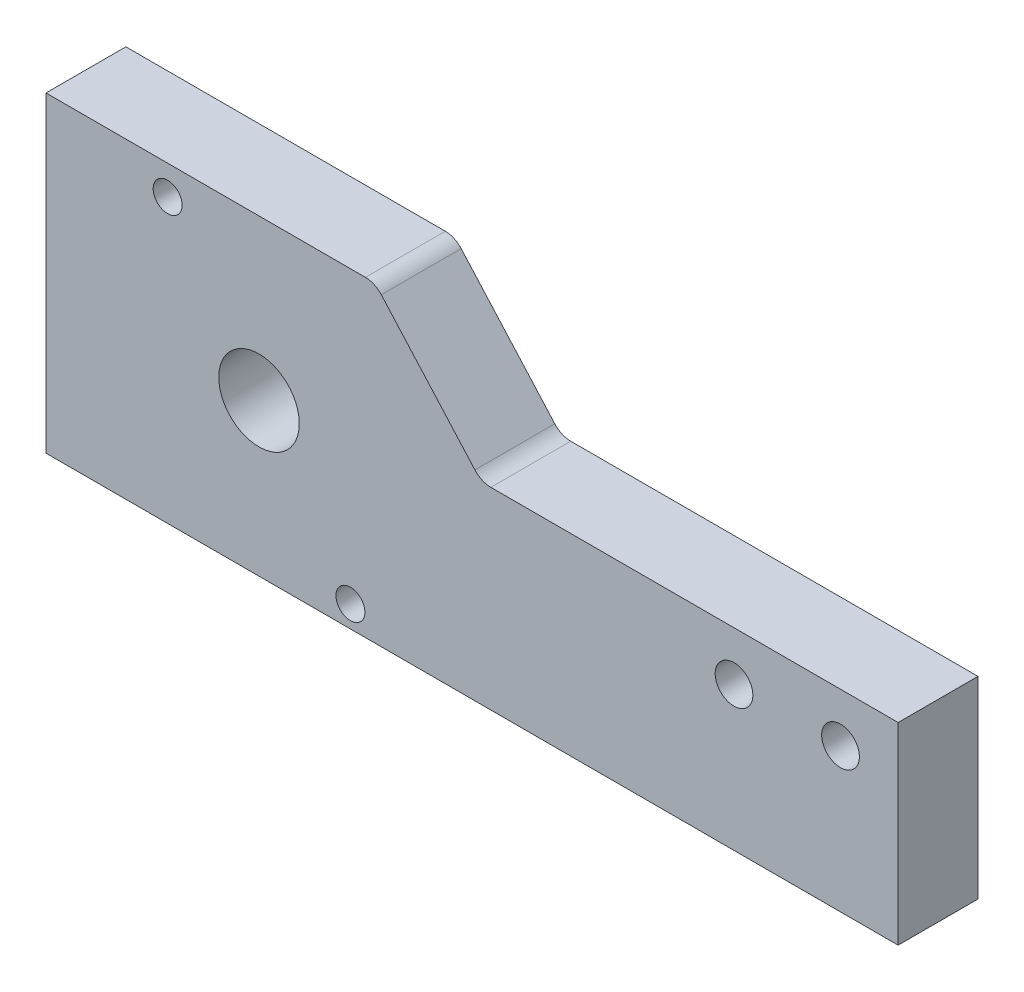
ISO-10303-21;
HEADER;
FILE_DESCRIPTION(('STEP AP214'),'2;1');
FILE_NAME('part.step','',(''),(''),'','','');
FILE_SCHEMA(('AUTOMOTIVE_DESIGN { 1 0 10303 214 1 1 1 1 }'));
ENDSEC;
DATA;
#1=APPLICATION_CONTEXT('core data for automotive mechanical design processes');
#2=APPLICATION_PROTOCOL_DEFINITION('international standard','automotive_design',2000,#1);
#3=PRODUCT_CONTEXT('',#1,'mechanical');
#4=PRODUCT('Part','Part','',(#3));
#5=PRODUCT_RELATED_PRODUCT_CATEGORY('part','',(#4));
#6=PRODUCT_DEFINITION_FORMATION('','',#4);
#7=PRODUCT_DEFINITION_CONTEXT('part definition',#1,'design');
#8=PRODUCT_DEFINITION('design','',#6,#7);
#9=PRODUCT_DEFINITION_SHAPE('','',#8);
#10=(LENGTH_UNIT() NAMED_UNIT(*) SI_UNIT(.MILLI.,.METRE.));
#11=(NAMED_UNIT(*) PLANE_ANGLE_UNIT() SI_UNIT($,.RADIAN.));
#12=(NAMED_UNIT(*) SI_UNIT($,.STERADIAN.) SOLID_ANGLE_UNIT());
#13=UNCERTAINTY_MEASURE_WITH_UNIT(LENGTH_MEASURE(1.E-05),#10,'distance_accuracy_value','');
#14=(GEOMETRIC_REPRESENTATION_CONTEXT(3) GLOBAL_UNCERTAINTY_ASSIGNED_CONTEXT((#13)) GLOBAL_UNIT_ASSIGNED_CONTEXT((#10,
#11,#12)) REPRESENTATION_CONTEXT('',''));
#15=CARTESIAN_POINT('',(0.,0.,0.));
#16=DIRECTION('',(0.,0.,1.));
#17=DIRECTION('',(1.,0.,0.));
#18=AXIS2_PLACEMENT_3D('',#15,#16,#17);
#19=CARTESIAN_POINT('',(-50.8,-25.4,9.525));
#20=DIRECTION('',(1.,0.,0.));
#21=DIRECTION('',(0.,0.,-1.));
#22=AXIS2_PLACEMENT_3D('',#19,#20,#21);
#23=PLANE('',#22);
#24=DIRECTION('',(0.,-1.,0.));
#25=VECTOR('',#24,1.);
#26=CARTESIAN_POINT('',(-50.8,-25.4,0.));
#27=LINE('',#26,#25);
#28=CARTESIAN_POINT('',(-50.8,25.4,0.));
#29=VERTEX_POINT('',#28);
#30=CARTESIAN_POINT('',(-50.8,-11.8015182196212,0.));
#31=VERTEX_POINT('',#30);
#32=EDGE_CURVE('E130',#29,#31,#27,.T.);
#33=ORIENTED_EDGE('',*,*,#32,.T.);
#34=DIRECTION('',(0.,0.,1.));
#35=VECTOR('',#34,1.);
#36=CARTESIAN_POINT('',(-50.8,-11.8015182196212,0.));
#37=LINE('',#36,#35);
#38=CARTESIAN_POINT('',(-50.8,-11.8015182196212,9.525));
#39=VERTEX_POINT('',#38);
#40=EDGE_CURVE('E301',#31,#39,#37,.T.);
#41=ORIENTED_EDGE('',*,*,#40,.T.);
#42=DIRECTION('',(0.,-1.,0.));
#43=VECTOR('',#42,1.);
#44=CARTESIAN_POINT('',(-50.8,-25.4,9.525));
#45=LINE('',#44,#43);
#46=CARTESIAN_POINT('',(-50.8,25.4,9.525));
#47=VERTEX_POINT('',#46);
#48=EDGE_CURVE('E132',#47,#39,#45,.T.);
#49=ORIENTED_EDGE('',*,*,#48,.F.);
#50=DIRECTION('',(0.,0.,-1.));
#51=VECTOR('',#50,1.);
#52=CARTESIAN_POINT('',(-50.8,25.4,9.525));
#53=LINE('',#52,#51);
#54=EDGE_CURVE('E139',#47,#29,#53,.T.);
#55=ORIENTED_EDGE('',*,*,#54,.T.);
#56=EDGE_LOOP('',(#33,#41,#49,#55));
#57=FACE_BOUND('',#56,.T.);
#58=ADVANCED_FACE('F39',(#57),#23,.F.);
#59=CARTESIAN_POINT('',(50.8,-25.4,9.525));
#60=DIRECTION('',(-1.,0.,0.));
#61=DIRECTION('',(0.,-1.,0.));
#62=AXIS2_PLACEMENT_3D('',#59,#60,#61);
#63=PLANE('',#62);
#64=DIRECTION('',(0.,1.,0.));
#65=VECTOR('',#64,1.);
#66=CARTESIAN_POINT('',(50.8,-25.4,0.));
#67=LINE('',#66,#65);
#68=CARTESIAN_POINT('',(50.8,-11.8015182196212,0.));
#69=VERTEX_POINT('',#68);
#70=CARTESIAN_POINT('',(50.8,11.1938850786653,0.));
#71=VERTEX_POINT('',#70);
#72=EDGE_CURVE('E108',#69,#71,#67,.T.);
#73=ORIENTED_EDGE('',*,*,#72,.T.);
#74=DIRECTION('',(0.,0.,1.));
#75=VECTOR('',#74,1.);
#76=CARTESIAN_POINT('',(50.8,11.1938850786653,0.));
#77=LINE('',#76,#75);
#78=CARTESIAN_POINT('',(50.8,11.1938850786653,9.525));
#79=VERTEX_POINT('',#78);
#80=EDGE_CURVE('E114',#71,#79,#77,.T.);
#81=ORIENTED_EDGE('',*,*,#80,.T.);
#82=DIRECTION('',(0.,1.,0.));
#83=VECTOR('',#82,1.);
#84=CARTESIAN_POINT('',(50.8,-25.4,9.525));
#85=LINE('',#84,#83);
#86=CARTESIAN_POINT('',(50.8,-11.8015182196212,9.525));
#87=VERTEX_POINT('',#86);
#88=EDGE_CURVE('E310',#87,#79,#85,.T.);
#89=ORIENTED_EDGE('',*,*,#88,.F.);
#90=DIRECTION('',(0.,0.,1.));
#91=VECTOR('',#90,1.);
#92=CARTESIAN_POINT('',(50.8,-11.8015182196212,0.));
#93=LINE('',#92,#91);
#94=EDGE_CURVE('E128',#69,#87,#93,.T.);
#95=ORIENTED_EDGE('',*,*,#94,.F.);
#96=EDGE_LOOP('',(#73,#81,#89,#95));
#97=FACE_BOUND('',#96,.T.);
#98=ADVANCED_FACE('F127',(#97),#63,.F.);
#99=CARTESIAN_POINT('',(50.8,25.4,9.525));
#100=DIRECTION('',(0.,-1.,0.));
#101=DIRECTION('',(1.,0.,0.));
#102=AXIS2_PLACEMENT_3D('',#99,#100,#101);
#103=PLANE('',#102);
#104=DIRECTION('',(-1.,0.,0.));
#105=VECTOR('',#104,1.);
#106=CARTESIAN_POINT('',(50.8,25.4,9.525));
#107=LINE('',#106,#105);
#108=CARTESIAN_POINT('',(-12.7145745700629,25.4,9.525));
#109=VERTEX_POINT('',#108);
#110=EDGE_CURVE('E143',#109,#47,#107,.T.);
#111=ORIENTED_EDGE('',*,*,#110,.F.);
#112=DIRECTION('',(0.,0.,1.));
#113=VECTOR('',#112,1.);
#114=CARTESIAN_POINT('',(-12.7145745700629,25.4,9.525));
#115=LINE('',#114,#113);
#116=CARTESIAN_POINT('',(-12.7145745700629,25.4,0.));
#117=VERTEX_POINT('',#116);
#118=EDGE_CURVE('E54',#109,#117,#115,.F.);
#119=ORIENTED_EDGE('',*,*,#118,.T.);
#120=DIRECTION('',(-1.,0.,0.));
#121=VECTOR('',#120,1.);
#122=CARTESIAN_POINT('',(50.8,25.4,0.));
#123=LINE('',#122,#121);
#124=EDGE_CURVE('E129',#117,#29,#123,.T.);
#125=ORIENTED_EDGE('',*,*,#124,.T.);
#126=ORIENTED_EDGE('',*,*,#54,.F.);
#127=EDGE_LOOP('',(#111,#119,#125,#126));
#128=FACE_BOUND('',#127,.T.);
#129=ADVANCED_FACE('F180',(#128),#103,.F.);
#130=CARTESIAN_POINT('',(0.,0.,9.525));
#131=DIRECTION('',(0.,0.,1.));
#132=DIRECTION('',(1.,0.,0.));
#133=AXIS2_PLACEMENT_3D('',#130,#131,#132);
#134=PLANE('',#133);
#135=DIRECTION('',(0.665685747327236,-0.746232192956977,0.));
#136=VECTOR('',#135,1.);
#137=CARTESIAN_POINT('',(1.09609525507062,11.1938850786653,9.525));
#138=LINE('',#137,#136);
#139=CARTESIAN_POINT('',(-10.8191447999521,24.5508417982112,9.525));
#140=VERTEX_POINT('',#139);
#141=CARTESIAN_POINT('',(0.338593076134966,12.0430432804541,9.525));
#142=VERTEX_POINT('',#141);
#143=EDGE_CURVE('E156',#140,#142,#138,.T.);
#144=ORIENTED_EDGE('',*,*,#143,.F.);
#145=CARTESIAN_POINT('',(-12.7145745700629,22.86,9.525));
#146=DIRECTION('',(0.,0.,1.));
#147=DIRECTION('',(1.,0.,0.));
#148=AXIS2_PLACEMENT_3D('',#145,#146,#147);
#149=CIRCLE('',#148,2.54);
#150=EDGE_CURVE('E62',#140,#109,#149,.T.);
#151=ORIENTED_EDGE('',*,*,#150,.T.);
#152=ORIENTED_EDGE('',*,*,#110,.T.);
#153=ORIENTED_EDGE('',*,*,#48,.T.);
#154=DIRECTION('',(-1.,0.,0.));
#155=VECTOR('',#154,1.);
#156=CARTESIAN_POINT('',(-50.8,-11.8015182196212,9.525));
#157=LINE('',#156,#155);
#158=EDGE_CURVE('E124',#87,#39,#157,.T.);
#159=ORIENTED_EDGE('',*,*,#158,.F.);
#160=ORIENTED_EDGE('',*,*,#88,.T.);
#161=DIRECTION('',(1.,0.,0.));
#162=VECTOR('',#161,1.);
#163=CARTESIAN_POINT('',(50.8,11.1938850786653,9.525));
#164=LINE('',#163,#162);
#165=CARTESIAN_POINT('',(2.23402284624569,11.1938850786653,9.525));
#166=VERTEX_POINT('',#165);
#167=EDGE_CURVE('E120',#166,#79,#164,.T.);
#168=ORIENTED_EDGE('',*,*,#167,.F.);
#169=CARTESIAN_POINT('',(2.23402284624569,13.7338850786653,9.525));
#170=DIRECTION('',(0.,0.,1.));
#171=DIRECTION('',(1.,0.,0.));
#172=AXIS2_PLACEMENT_3D('',#169,#170,#171);
#173=CIRCLE('',#172,2.54);
#174=EDGE_CURVE('E47',#166,#142,#173,.F.);
#175=ORIENTED_EDGE('',*,*,#174,.T.);
#176=EDGE_LOOP('',(#144,#151,#152,#153,#159,#160,#168,#175));
#177=FACE_BOUND('',#176,.T.);
#178=CARTESIAN_POINT('',(31.2318140566515,5.34348178041263,9.525));
#179=DIRECTION('',(0.,0.,1.));
#180=DIRECTION('',(1.,0.,0.));
#181=AXIS2_PLACEMENT_3D('',#178,#179,#180);
#182=CIRCLE('',#181,2.2479);
#183=CARTESIAN_POINT('',(33.4797140566515,5.34348178041263,9.525));
#184=VERTEX_POINT('',#183);
#185=EDGE_CURVE('E307',#184,#184,#182,.T.);
#186=ORIENTED_EDGE('',*,*,#185,.F.);
#187=EDGE_LOOP('',(#186));
#188=FACE_BOUND('',#187,.T.);
#189=CARTESIAN_POINT('',(43.9318140566515,5.34348178041787,9.525));
#190=DIRECTION('',(0.,0.,1.));
#191=DIRECTION('',(1.,0.,0.));
#192=AXIS2_PLACEMENT_3D('',#189,#190,#191);
#193=CIRCLE('',#192,2.2479);
#194=CARTESIAN_POINT('',(46.1797140566515,5.34348178041787,9.525));
#195=VERTEX_POINT('',#194);
#196=EDGE_CURVE('E334',#195,#195,#193,.T.);
#197=ORIENTED_EDGE('',*,*,#196,.F.);
#198=EDGE_LOOP('',(#197));
#199=FACE_BOUND('',#198,.T.);
#200=CARTESIAN_POINT('',(-36.29795229067,21.9138888414908,9.525));
#201=DIRECTION('',(0.,0.,1.));
#202=DIRECTION('',(1.,0.,0.));
#203=AXIS2_PLACEMENT_3D('',#200,#201,#202);
#204=CIRCLE('',#203,1.72719999999998);
#205=CARTESIAN_POINT('',(-34.57075229067,21.9138888414908,9.525));
#206=VERTEX_POINT('',#205);
#207=EDGE_CURVE('E328',#206,#206,#204,.T.);
#208=ORIENTED_EDGE('',*,*,#207,.F.);
#209=EDGE_LOOP('',(#208));
#210=FACE_BOUND('',#209,.T.);
#211=CARTESIAN_POINT('',(-14.50204770933,-9.21388884149079,9.525));
#212=DIRECTION('',(0.,0.,1.));
#213=DIRECTION('',(1.,0.,0.));
#214=AXIS2_PLACEMENT_3D('',#211,#212,#213);
#215=CIRCLE('',#214,1.72719999999999);
#216=CARTESIAN_POINT('',(-12.7748477093301,-9.21388884149079,9.525));
#217=VERTEX_POINT('',#216);
#218=EDGE_CURVE('E322',#217,#217,#215,.T.);
#219=ORIENTED_EDGE('',*,*,#218,.F.);
#220=EDGE_LOOP('',(#219));
#221=FACE_BOUND('',#220,.T.);
#222=CARTESIAN_POINT('',(-25.4,6.34999999999999,9.525));
#223=DIRECTION('',(0.,0.,1.));
#224=DIRECTION('',(1.,0.,0.));
#225=AXIS2_PLACEMENT_3D('',#222,#223,#224);
#226=CIRCLE('',#225,4.8);
#227=CARTESIAN_POINT('',(-30.2,6.34999999999999,9.525));
#228=VERTEX_POINT('',#227);
#229=EDGE_CURVE('E135',#228,#228,#226,.T.);
#230=ORIENTED_EDGE('',*,*,#229,.F.);
#231=EDGE_LOOP('',(#230));
#232=FACE_BOUND('',#231,.T.);
#233=ADVANCED_FACE('F154',(#177,#188,#199,#210,#221,#232),#134,.T.);
#234=CARTESIAN_POINT('',(0.,0.,0.));
#235=DIRECTION('',(0.,0.,1.));
#236=DIRECTION('',(1.,0.,0.));
#237=AXIS2_PLACEMENT_3D('',#234,#235,#236);
#238=PLANE('',#237);
#239=CARTESIAN_POINT('',(31.2318140566515,5.34348178041263,0.));
#240=DIRECTION('',(0.,0.,1.));
#241=DIRECTION('',(1.,0.,0.));
#242=AXIS2_PLACEMENT_3D('',#239,#240,#241);
#243=CIRCLE('',#242,2.2479);
#244=CARTESIAN_POINT('',(33.4797140566515,5.34348178041263,0.));
#245=VERTEX_POINT('',#244);
#246=EDGE_CURVE('E337',#245,#245,#243,.T.);
#247=ORIENTED_EDGE('',*,*,#246,.T.);
#248=EDGE_LOOP('',(#247));
#249=FACE_BOUND('',#248,.T.);
#250=CARTESIAN_POINT('',(43.9318140566515,5.34348178041787,0.));
#251=DIRECTION('',(0.,0.,1.));
#252=DIRECTION('',(1.,0.,0.));
#253=AXIS2_PLACEMENT_3D('',#250,#251,#252);
#254=CIRCLE('',#253,2.2479);
#255=CARTESIAN_POINT('',(46.1797140566515,5.34348178041787,0.));
#256=VERTEX_POINT('',#255);
#257=EDGE_CURVE('E331',#256,#256,#254,.T.);
#258=ORIENTED_EDGE('',*,*,#257,.T.);
#259=EDGE_LOOP('',(#258));
#260=FACE_BOUND('',#259,.T.);
#261=CARTESIAN_POINT('',(-36.29795229067,21.9138888414908,0.));
#262=DIRECTION('',(0.,0.,1.));
#263=DIRECTION('',(1.,0.,0.));
#264=AXIS2_PLACEMENT_3D('',#261,#262,#263);
#265=CIRCLE('',#264,1.7272);
#266=CARTESIAN_POINT('',(-34.57075229067,21.9138888414908,0.));
#267=VERTEX_POINT('',#266);
#268=EDGE_CURVE('E325',#267,#267,#265,.T.);
#269=ORIENTED_EDGE('',*,*,#268,.T.);
#270=EDGE_LOOP('',(#269));
#271=FACE_BOUND('',#270,.T.);
#272=CARTESIAN_POINT('',(-14.50204770933,-9.21388884149079,0.));
#273=DIRECTION('',(0.,0.,1.));
#274=DIRECTION('',(1.,0.,0.));
#275=AXIS2_PLACEMENT_3D('',#272,#273,#274);
#276=CIRCLE('',#275,1.7272);
#277=CARTESIAN_POINT('',(-12.7748477093301,-9.21388884149079,0.));
#278=VERTEX_POINT('',#277);
#279=EDGE_CURVE('E317',#278,#278,#276,.T.);
#280=ORIENTED_EDGE('',*,*,#279,.T.);
#281=EDGE_LOOP('',(#280));
#282=FACE_BOUND('',#281,.T.);
#283=CARTESIAN_POINT('',(-25.4,6.34999999999999,0.));
#284=DIRECTION('',(0.,0.,1.));
#285=DIRECTION('',(1.,0.,0.));
#286=AXIS2_PLACEMENT_3D('',#283,#284,#285);
#287=CIRCLE('',#286,4.8);
#288=CARTESIAN_POINT('',(-30.2,6.34999999999999,0.));
#289=VERTEX_POINT('',#288);
#290=EDGE_CURVE('E314',#289,#289,#287,.T.);
#291=ORIENTED_EDGE('',*,*,#290,.T.);
#292=EDGE_LOOP('',(#291));
#293=FACE_BOUND('',#292,.T.);
#294=ORIENTED_EDGE('',*,*,#124,.F.);
#295=CARTESIAN_POINT('',(-12.7145745700629,22.86,0.));
#296=DIRECTION('',(0.,0.,1.));
#297=DIRECTION('',(1.,0.,0.));
#298=AXIS2_PLACEMENT_3D('',#295,#296,#297);
#299=CIRCLE('',#298,2.54);
#300=CARTESIAN_POINT('',(-10.8191447999521,24.5508417982112,0.));
#301=VERTEX_POINT('',#300);
#302=EDGE_CURVE('E152',#117,#301,#299,.F.);
#303=ORIENTED_EDGE('',*,*,#302,.T.);
#304=DIRECTION('',(0.665685747327236,-0.746232192956977,0.));
#305=VECTOR('',#304,1.);
#306=CARTESIAN_POINT('',(1.09609525507062,11.1938850786653,0.));
#307=LINE('',#306,#305);
#308=CARTESIAN_POINT('',(0.338593076134966,12.0430432804541,0.));
#309=VERTEX_POINT('',#308);
#310=EDGE_CURVE('E115',#301,#309,#307,.T.);
#311=ORIENTED_EDGE('',*,*,#310,.T.);
#312=CARTESIAN_POINT('',(2.23402284624569,13.7338850786653,0.));
#313=DIRECTION('',(0.,0.,1.));
#314=DIRECTION('',(1.,0.,0.));
#315=AXIS2_PLACEMENT_3D('',#312,#313,#314);
#316=CIRCLE('',#315,2.54);
#317=CARTESIAN_POINT('',(2.23402284624569,11.1938850786653,0.));
#318=VERTEX_POINT('',#317);
#319=EDGE_CURVE('E11',#309,#318,#316,.T.);
#320=ORIENTED_EDGE('',*,*,#319,.T.);
#321=DIRECTION('',(1.,0.,0.));
#322=VECTOR('',#321,1.);
#323=CARTESIAN_POINT('',(50.8,11.1938850786653,0.));
#324=LINE('',#323,#322);
#325=EDGE_CURVE('E103',#318,#71,#324,.T.);
#326=ORIENTED_EDGE('',*,*,#325,.T.);
#327=ORIENTED_EDGE('',*,*,#72,.F.);
#328=DIRECTION('',(-1.,0.,0.));
#329=VECTOR('',#328,1.);
#330=CARTESIAN_POINT('',(-50.8,-11.8015182196212,0.));
#331=LINE('',#330,#329);
#332=EDGE_CURVE('E303',#69,#31,#331,.T.);
#333=ORIENTED_EDGE('',*,*,#332,.T.);
#334=ORIENTED_EDGE('',*,*,#32,.F.);
#335=EDGE_LOOP('',(#294,#303,#311,#320,#326,#327,#333,#334));
#336=FACE_BOUND('',#335,.T.);
#337=ADVANCED_FACE('F105',(#249,#260,#271,#282,#293,#336),#238,.F.);
#338=CARTESIAN_POINT('',(-25.4,6.34999999999999,9.525));
#339=DIRECTION('',(0.,0.,-1.));
#340=DIRECTION('',(-1.,0.,0.));
#341=AXIS2_PLACEMENT_3D('',#338,#339,#340);
#342=CYLINDRICAL_SURFACE('',#341,4.8);
#343=CARTESIAN_POINT('',(-30.2,6.34999999999999,9.525));
#344=CARTESIAN_POINT('',(-30.2,6.34999999999999,9.42578125));
#345=CARTESIAN_POINT('',(-30.2,6.34999999999999,9.3265625));
#346=CARTESIAN_POINT('',(-30.2,6.34999999999999,9.128125));
#347=CARTESIAN_POINT('',(-30.2,6.34999999999999,9.02890625));
#348=CARTESIAN_POINT('',(-30.2,6.34999999999999,8.83046875));
#349=CARTESIAN_POINT('',(-30.2,6.34999999999999,8.73125));
#350=CARTESIAN_POINT('',(-30.2,6.34999999999999,8.5328125));
#351=CARTESIAN_POINT('',(-30.2,6.34999999999999,8.43359375));
#352=CARTESIAN_POINT('',(-30.2,6.34999999999999,8.23515625));
#353=CARTESIAN_POINT('',(-30.2,6.34999999999999,8.1359375));
#354=CARTESIAN_POINT('',(-30.2,6.34999999999999,7.9375));
#355=CARTESIAN_POINT('',(-30.2,6.34999999999999,7.83828125));
#356=CARTESIAN_POINT('',(-30.2,6.34999999999999,7.63984375));
#357=CARTESIAN_POINT('',(-30.2,6.34999999999999,7.540625));
#358=CARTESIAN_POINT('',(-30.2,6.34999999999999,7.3421875));
#359=CARTESIAN_POINT('',(-30.2,6.34999999999999,7.24296875));
#360=CARTESIAN_POINT('',(-30.2,6.34999999999999,7.04453125));
#361=CARTESIAN_POINT('',(-30.2,6.34999999999999,6.9453125));
#362=CARTESIAN_POINT('',(-30.2,6.34999999999999,6.746875));
#363=CARTESIAN_POINT('',(-30.2,6.34999999999999,6.64765625));
#364=CARTESIAN_POINT('',(-30.2,6.34999999999999,6.44921875));
#365=CARTESIAN_POINT('',(-30.2,6.34999999999999,6.35));
#366=CARTESIAN_POINT('',(-30.2,6.34999999999999,6.1515625));
#367=CARTESIAN_POINT('',(-30.2,6.34999999999999,6.05234375));
#368=CARTESIAN_POINT('',(-30.2,6.34999999999999,5.85390625));
#369=CARTESIAN_POINT('',(-30.2,6.34999999999999,5.7546875));
#370=CARTESIAN_POINT('',(-30.2,6.34999999999999,5.55625));
#371=CARTESIAN_POINT('',(-30.2,6.34999999999999,5.45703125));
#372=CARTESIAN_POINT('',(-30.2,6.34999999999999,5.25859375));
#373=CARTESIAN_POINT('',(-30.2,6.34999999999999,5.159375));
#374=CARTESIAN_POINT('',(-30.2,6.34999999999999,4.9609375));
#375=CARTESIAN_POINT('',(-30.2,6.34999999999999,4.86171875));
#376=CARTESIAN_POINT('',(-30.2,6.34999999999999,4.66328125));
#377=CARTESIAN_POINT('',(-30.2,6.34999999999999,4.5640625));
#378=CARTESIAN_POINT('',(-30.2,6.34999999999999,4.365625));
#379=CARTESIAN_POINT('',(-30.2,6.34999999999999,4.26640625));
#380=CARTESIAN_POINT('',(-30.2,6.34999999999999,4.06796875));
#381=CARTESIAN_POINT('',(-30.2,6.34999999999999,3.96875));
#382=CARTESIAN_POINT('',(-30.2,6.34999999999999,3.7703125));
#383=CARTESIAN_POINT('',(-30.2,6.34999999999999,3.67109375));
#384=CARTESIAN_POINT('',(-30.2,6.34999999999999,3.47265625));
#385=CARTESIAN_POINT('',(-30.2,6.34999999999999,3.3734375));
#386=CARTESIAN_POINT('',(-30.2,6.34999999999999,3.175));
#387=CARTESIAN_POINT('',(-30.2,6.34999999999999,3.07578125));
#388=CARTESIAN_POINT('',(-30.2,6.34999999999999,2.87734375));
#389=CARTESIAN_POINT('',(-30.2,6.34999999999999,2.778125));
#390=CARTESIAN_POINT('',(-30.2,6.34999999999999,2.5796875));
#391=CARTESIAN_POINT('',(-30.2,6.34999999999999,2.48046875));
#392=CARTESIAN_POINT('',(-30.2,6.34999999999999,2.28203125));
#393=CARTESIAN_POINT('',(-30.2,6.34999999999999,2.1828125));
#394=CARTESIAN_POINT('',(-30.2,6.34999999999999,1.984375));
#395=CARTESIAN_POINT('',(-30.2,6.34999999999999,1.88515625));
#396=CARTESIAN_POINT('',(-30.2,6.34999999999999,1.68671875));
#397=CARTESIAN_POINT('',(-30.2,6.34999999999999,1.5875));
#398=CARTESIAN_POINT('',(-30.2,6.34999999999999,1.3890625));
#399=CARTESIAN_POINT('',(-30.2,6.34999999999999,1.28984375));
#400=CARTESIAN_POINT('',(-30.2,6.34999999999999,1.09140625));
#401=CARTESIAN_POINT('',(-30.2,6.34999999999999,0.992187500000001));
#402=CARTESIAN_POINT('',(-30.2,6.34999999999999,0.793750000000001));
#403=CARTESIAN_POINT('',(-30.2,6.34999999999999,0.69453125));
#404=CARTESIAN_POINT('',(-30.2,6.34999999999999,0.49609375));
#405=CARTESIAN_POINT('',(-30.2,6.34999999999999,0.396875));
#406=CARTESIAN_POINT('',(-30.2,6.34999999999999,0.1984375));
#407=CARTESIAN_POINT('',(-30.2,6.34999999999999,0.0992187500000001));
#408=CARTESIAN_POINT('',(-30.2,6.34999999999999,0.));
#409=B_SPLINE_CURVE_WITH_KNOTS('',3,(#343,#344,#345,#346,#347,#348,#349,#350,#351,#352,#353,
#354,#355,#356,#357,#358,#359,#360,#361,#362,#363,#364,#365,#366,#367,#368,#369,#370,#371,#372,
#373,#374,#375,#376,#377,#378,#379,#380,#381,#382,#383,#384,#385,#386,#387,#388,#389,#390,#391,
#392,#393,#394,#395,#396,#397,#398,#399,#400,#401,#402,#403,#404,#405,#406,#407,#408),
.UNSPECIFIED.,.F.,.F.,(4,2,2,2,2,2,2,2,2,2,2,2,2,2,2,2,2,2,2,2,2,2,2,2,2,2,2,2,2,2,2,2,4),(0.,
0.29765625,0.5953125,0.892968750000001,1.190625,1.48828125,1.7859375,2.08359375,2.38125,
2.67890625,2.9765625,3.27421875,3.571875,3.86953125,4.1671875,4.46484375,4.7625,5.06015625,
5.3578125,5.65546875,5.953125,6.25078125,6.5484375,6.84609375,7.14375,7.44140625,7.7390625,
8.03671875,8.334375,8.63203125,8.9296875,9.22734375,9.525),.UNSPECIFIED.);
#410=EDGE_CURVE('BSEAM187',#228,#289,#409,.T.);
#411=ORIENTED_EDGE('',*,*,#229,.T.);
#412=ORIENTED_EDGE('',*,*,#290,.F.);
#413=ORIENTED_EDGE('',*,*,#410,.T.);
#414=ORIENTED_EDGE('',*,*,#410,.F.);
#415=EDGE_LOOP('',(#411,#413,#412,#414));
#416=FACE_BOUND('',#415,.T.);
#417=ADVANCED_FACE('F187',(#416),#342,.F.);
#418=CARTESIAN_POINT('',(-14.50204770933,-9.21388884149079,9.525));
#419=DIRECTION('',(0.,0.,1.));
#420=DIRECTION('',(1.,0.,0.));
#421=AXIS2_PLACEMENT_3D('',#418,#419,#420);
#422=CYLINDRICAL_SURFACE('',#421,1.72719999999999);
#423=ORIENTED_EDGE('',*,*,#279,.F.);
#424=EDGE_LOOP('',(#423));
#425=FACE_BOUND('',#424,.T.);
#426=ORIENTED_EDGE('',*,*,#218,.T.);
#427=EDGE_LOOP('',(#426));
#428=FACE_BOUND('',#427,.T.);
#429=ADVANCED_FACE('F193',(#425,#428),#422,.F.);
#430=CARTESIAN_POINT('',(-36.29795229067,21.9138888414908,9.525));
#431=DIRECTION('',(0.,0.,1.));
#432=DIRECTION('',(1.,0.,0.));
#433=AXIS2_PLACEMENT_3D('',#430,#431,#432);
#434=CYLINDRICAL_SURFACE('',#433,1.72719999999999);
#435=ORIENTED_EDGE('',*,*,#268,.F.);
#436=EDGE_LOOP('',(#435));
#437=FACE_BOUND('',#436,.T.);
#438=ORIENTED_EDGE('',*,*,#207,.T.);
#439=EDGE_LOOP('',(#438));
#440=FACE_BOUND('',#439,.T.);
#441=ADVANCED_FACE('F197',(#437,#440),#434,.F.);
#442=CARTESIAN_POINT('',(43.9318140566515,5.34348178041787,9.525));
#443=DIRECTION('',(0.,0.,1.));
#444=DIRECTION('',(1.,0.,0.));
#445=AXIS2_PLACEMENT_3D('',#442,#443,#444);
#446=CYLINDRICAL_SURFACE('',#445,2.2479);
#447=ORIENTED_EDGE('',*,*,#257,.F.);
#448=EDGE_LOOP('',(#447));
#449=FACE_BOUND('',#448,.T.);
#450=ORIENTED_EDGE('',*,*,#196,.T.);
#451=EDGE_LOOP('',(#450));
#452=FACE_BOUND('',#451,.T.);
#453=ADVANCED_FACE('F201',(#449,#452),#446,.F.);
#454=CARTESIAN_POINT('',(31.2318140566515,5.34348178041263,9.525));
#455=DIRECTION('',(0.,0.,1.));
#456=DIRECTION('',(1.,0.,0.));
#457=AXIS2_PLACEMENT_3D('',#454,#455,#456);
#458=CYLINDRICAL_SURFACE('',#457,2.2479);
#459=ORIENTED_EDGE('',*,*,#246,.F.);
#460=EDGE_LOOP('',(#459));
#461=FACE_BOUND('',#460,.T.);
#462=ORIENTED_EDGE('',*,*,#185,.T.);
#463=EDGE_LOOP('',(#462));
#464=FACE_BOUND('',#463,.T.);
#465=ADVANCED_FACE('F205',(#461,#464),#458,.F.);
#466=CARTESIAN_POINT('',(-50.8,-11.8015182196212,0.));
#467=DIRECTION('',(0.,1.,0.));
#468=DIRECTION('',(0.,0.,1.));
#469=AXIS2_PLACEMENT_3D('',#466,#467,#468);
#470=PLANE('',#469);
#471=ORIENTED_EDGE('',*,*,#158,.T.);
#472=ORIENTED_EDGE('',*,*,#40,.F.);
#473=ORIENTED_EDGE('',*,*,#332,.F.);
#474=ORIENTED_EDGE('',*,*,#94,.T.);
#475=EDGE_LOOP('',(#471,#472,#473,#474));
#476=FACE_BOUND('',#475,.T.);
#477=ADVANCED_FACE('F208',(#476),#470,.F.);
#478=CARTESIAN_POINT('',(50.8,11.1938850786653,0.));
#479=DIRECTION('',(0.,-1.,0.));
#480=DIRECTION('',(0.,0.,-1.));
#481=AXIS2_PLACEMENT_3D('',#478,#479,#480);
#482=PLANE('',#481);
#483=ORIENTED_EDGE('',*,*,#325,.F.);
#484=DIRECTION('',(0.,0.,1.));
#485=VECTOR('',#484,1.);
#486=CARTESIAN_POINT('',(2.23402284624569,11.1938850786653,9.525));
#487=LINE('',#486,#485);
#488=EDGE_CURVE('E142',#318,#166,#487,.T.);
#489=ORIENTED_EDGE('',*,*,#488,.T.);
#490=ORIENTED_EDGE('',*,*,#167,.T.);
#491=ORIENTED_EDGE('',*,*,#80,.F.);
#492=EDGE_LOOP('',(#483,#489,#490,#491));
#493=FACE_BOUND('',#492,.T.);
#494=ADVANCED_FACE('F118',(#493),#482,.F.);
#495=CARTESIAN_POINT('',(1.09609525507062,11.1938850786653,0.));
#496=DIRECTION('',(-0.746232192956977,-0.665685747327236,0.));
#497=DIRECTION('',(0.665685747327236,-0.746232192956977,0.));
#498=AXIS2_PLACEMENT_3D('',#495,#496,#497);
#499=PLANE('',#498);
#500=ORIENTED_EDGE('',*,*,#143,.T.);
#501=DIRECTION('',(0.,0.,1.));
#502=VECTOR('',#501,1.);
#503=CARTESIAN_POINT('',(0.338593076134966,12.0430432804541,0.));
#504=LINE('',#503,#502);
#505=EDGE_CURVE('E148',#142,#309,#504,.F.);
#506=ORIENTED_EDGE('',*,*,#505,.T.);
#507=ORIENTED_EDGE('',*,*,#310,.F.);
#508=DIRECTION('',(0.,0.,1.));
#509=VECTOR('',#508,1.);
#510=CARTESIAN_POINT('',(-10.8191447999521,24.5508417982112,0.));
#511=LINE('',#510,#509);
#512=EDGE_CURVE('E145',#301,#140,#511,.T.);
#513=ORIENTED_EDGE('',*,*,#512,.T.);
#514=EDGE_LOOP('',(#500,#506,#507,#513));
#515=FACE_BOUND('',#514,.T.);
#516=ADVANCED_FACE('F160',(#515),#499,.F.);
#517=CARTESIAN_POINT('',(2.23402284624569,13.7338850786653,0.));
#518=DIRECTION('',(0.,0.,-1.));
#519=DIRECTION('',(-1.,0.,0.));
#520=AXIS2_PLACEMENT_3D('',#517,#518,#519);
#521=CYLINDRICAL_SURFACE('',#520,2.54);
#522=ORIENTED_EDGE('',*,*,#319,.F.);
#523=ORIENTED_EDGE('',*,*,#505,.F.);
#524=ORIENTED_EDGE('',*,*,#174,.F.);
#525=ORIENTED_EDGE('',*,*,#488,.F.);
#526=EDGE_LOOP('',(#522,#523,#524,#525));
#527=FACE_BOUND('',#526,.T.);
#528=ADVANCED_FACE('F164',(#527),#521,.F.);
#529=CARTESIAN_POINT('',(-12.7145745700629,22.86,0.));
#530=DIRECTION('',(0.,0.,1.));
#531=DIRECTION('',(1.,0.,0.));
#532=AXIS2_PLACEMENT_3D('',#529,#530,#531);
#533=CYLINDRICAL_SURFACE('',#532,2.54);
#534=ORIENTED_EDGE('',*,*,#302,.F.);
#535=ORIENTED_EDGE('',*,*,#118,.F.);
#536=ORIENTED_EDGE('',*,*,#150,.F.);
#537=ORIENTED_EDGE('',*,*,#512,.F.);
#538=EDGE_LOOP('',(#534,#535,#536,#537));
#539=FACE_BOUND('',#538,.T.);
#540=ADVANCED_FACE('F41',(#539),#533,.T.);
#541=CLOSED_SHELL('',(#58,#98,#129,#233,#337,#417,#429,#441,#453,#465,#477,#494,#516,#528,#540));
#542=MANIFOLD_SOLID_BREP('B2',#541);
#543=ADVANCED_BREP_SHAPE_REPRESENTATION('',(#18,#542),#14);
#544=SHAPE_DEFINITION_REPRESENTATION(#9,#543);
ENDSEC;
END-ISO-10303-21;
